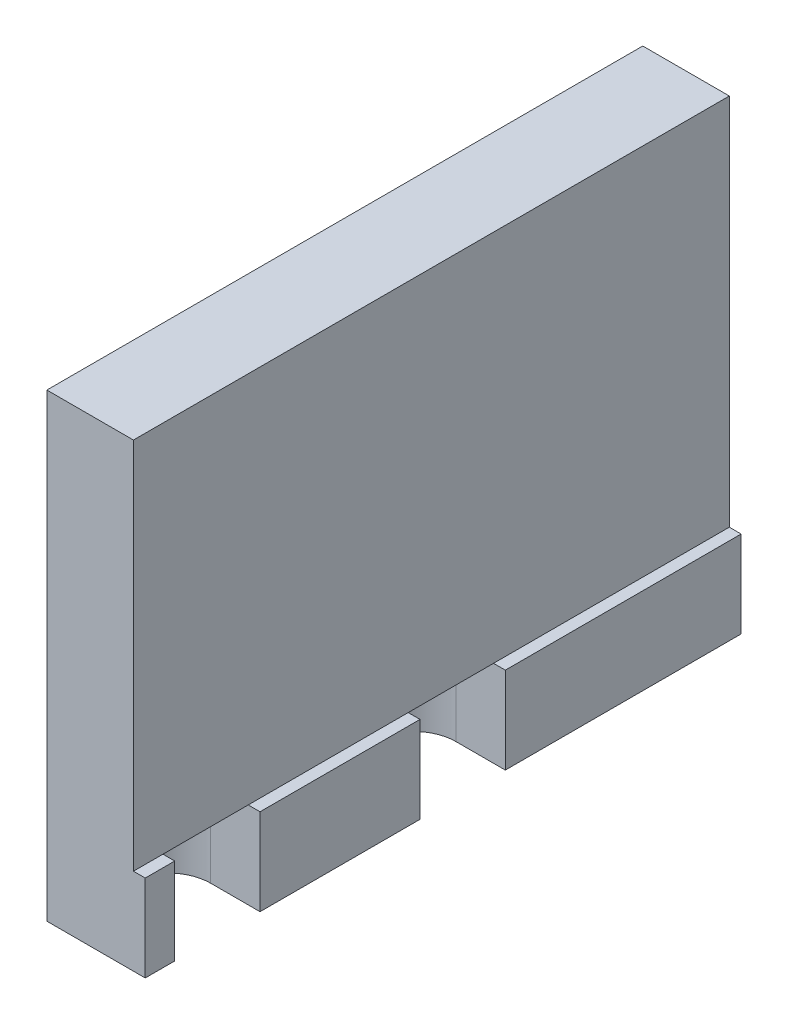
ISO-10303-21;
HEADER;
FILE_DESCRIPTION(('STEP AP214'),'2;1');
FILE_NAME('part.step','',(''),(''),'','','');
FILE_SCHEMA(('AUTOMOTIVE_DESIGN { 1 0 10303 214 1 1 1 1 }'));
ENDSEC;
DATA;
#1=APPLICATION_CONTEXT('core data for automotive mechanical design processes');
#2=APPLICATION_PROTOCOL_DEFINITION('international standard','automotive_design',2000,#1);
#3=PRODUCT_CONTEXT('',#1,'mechanical');
#4=PRODUCT('Part','Part','',(#3));
#5=PRODUCT_RELATED_PRODUCT_CATEGORY('part','',(#4));
#6=PRODUCT_DEFINITION_FORMATION('','',#4);
#7=PRODUCT_DEFINITION_CONTEXT('part definition',#1,'design');
#8=PRODUCT_DEFINITION('design','',#6,#7);
#9=PRODUCT_DEFINITION_SHAPE('','',#8);
#10=(LENGTH_UNIT() NAMED_UNIT(*) SI_UNIT(.MILLI.,.METRE.));
#11=(NAMED_UNIT(*) PLANE_ANGLE_UNIT() SI_UNIT($,.RADIAN.));
#12=(NAMED_UNIT(*) SI_UNIT($,.STERADIAN.) SOLID_ANGLE_UNIT());
#13=UNCERTAINTY_MEASURE_WITH_UNIT(LENGTH_MEASURE(1.E-05),#10,'distance_accuracy_value','');
#14=(GEOMETRIC_REPRESENTATION_CONTEXT(3) GLOBAL_UNCERTAINTY_ASSIGNED_CONTEXT((#13)) GLOBAL_UNIT_ASSIGNED_CONTEXT((#10,
#11,#12)) REPRESENTATION_CONTEXT('',''));
#15=CARTESIAN_POINT('',(0.,0.,0.));
#16=DIRECTION('',(0.,0.,1.));
#17=DIRECTION('',(1.,0.,0.));
#18=AXIS2_PLACEMENT_3D('',#15,#16,#17);
#19=CARTESIAN_POINT('',(-0.818281610185816,6.,27.));
#20=DIRECTION('',(0.,1.,0.));
#21=DIRECTION('',(0.,0.,1.));
#22=AXIS2_PLACEMENT_3D('',#19,#20,#21);
#23=PLANE('',#22);
#24=DIRECTION('',(1.,0.,0.));
#25=VECTOR('',#24,1.);
#26=CARTESIAN_POINT('',(-3.41828161018498,6.,7.95603271983645));
#27=LINE('',#26,#25);
#28=CARTESIAN_POINT('',(-0.818281610185816,6.,7.95603271983645));
#29=VERTEX_POINT('',#28);
#30=CARTESIAN_POINT('',(0.,6.,7.95603271983645));
#31=VERTEX_POINT('',#30);
#32=EDGE_CURVE('E239',#29,#31,#27,.T.);
#33=ORIENTED_EDGE('',*,*,#32,.F.);
#34=DIRECTION('',(0.,0.,-1.));
#35=VECTOR('',#34,1.);
#36=CARTESIAN_POINT('',(-0.818281610185816,6.,27.));
#37=LINE('',#36,#35);
#38=CARTESIAN_POINT('',(-0.818281610185812,6.,19.0439672801637));
#39=VERTEX_POINT('',#38);
#40=EDGE_CURVE('E204',#39,#29,#37,.T.);
#41=ORIENTED_EDGE('',*,*,#40,.F.);
#42=DIRECTION('',(-1.,0.,0.));
#43=VECTOR('',#42,1.);
#44=CARTESIAN_POINT('',(8.68171838981503,6.,19.0439672801637));
#45=LINE('',#44,#43);
#46=CARTESIAN_POINT('',(0.,6.,19.0439672801637));
#47=VERTEX_POINT('',#46);
#48=EDGE_CURVE('E242',#47,#39,#45,.T.);
#49=ORIENTED_EDGE('',*,*,#48,.F.);
#50=DIRECTION('',(0.,0.,-1.));
#51=VECTOR('',#50,1.);
#52=CARTESIAN_POINT('',(0.,6.,27.));
#53=LINE('',#52,#51);
#54=EDGE_CURVE('E216',#47,#31,#53,.T.);
#55=ORIENTED_EDGE('',*,*,#54,.T.);
#56=EDGE_LOOP('',(#33,#41,#49,#55));
#57=FACE_BOUND('',#56,.T.);
#58=ADVANCED_FACE('F37',(#57),#23,.T.);
#59=DIRECTION('',(1.,0.,0.));
#60=VECTOR('',#59,1.);
#61=CARTESIAN_POINT('',(-3.41828161018498,6.,24.9560327198365));
#62=LINE('',#61,#60);
#63=CARTESIAN_POINT('',(-0.818281610185816,6.,24.9560327198365));
#64=VERTEX_POINT('',#63);
#65=CARTESIAN_POINT('',(0.,6.,24.9560327198365));
#66=VERTEX_POINT('',#65);
#67=EDGE_CURVE('E276',#64,#66,#62,.T.);
#68=ORIENTED_EDGE('',*,*,#67,.F.);
#69=CARTESIAN_POINT('',(-0.818281610185816,6.,27.));
#70=VERTEX_POINT('',#69);
#71=EDGE_CURVE('E200',#70,#64,#37,.T.);
#72=ORIENTED_EDGE('',*,*,#71,.F.);
#73=DIRECTION('',(1.,0.,0.));
#74=VECTOR('',#73,1.);
#75=CARTESIAN_POINT('',(-0.818281610185816,6.,27.));
#76=LINE('',#75,#74);
#77=CARTESIAN_POINT('',(0.,6.,27.));
#78=VERTEX_POINT('',#77);
#79=EDGE_CURVE('E187',#70,#78,#76,.T.);
#80=ORIENTED_EDGE('',*,*,#79,.T.);
#81=EDGE_CURVE('E213',#78,#66,#53,.T.);
#82=ORIENTED_EDGE('',*,*,#81,.T.);
#83=EDGE_LOOP('',(#68,#72,#80,#82));
#84=FACE_BOUND('',#83,.T.);
#85=ADVANCED_FACE('F306',(#84),#23,.T.);
#86=CARTESIAN_POINT('',(0.,6.,27.));
#87=DIRECTION('',(1.,0.,0.));
#88=DIRECTION('',(0.,0.,-1.));
#89=AXIS2_PLACEMENT_3D('',#86,#87,#88);
#90=PLANE('',#89);
#91=DIRECTION('',(0.,-1.,0.));
#92=VECTOR('',#91,1.);
#93=CARTESIAN_POINT('',(0.,6.,7.95603271983646));
#94=LINE('',#93,#92);
#95=CARTESIAN_POINT('',(0.,0.,7.95603271983645));
#96=VERTEX_POINT('',#95);
#97=EDGE_CURVE('E11',#31,#96,#94,.T.);
#98=ORIENTED_EDGE('',*,*,#97,.F.);
#99=ORIENTED_EDGE('',*,*,#54,.F.);
#100=DIRECTION('',(0.,1.,0.));
#101=VECTOR('',#100,1.);
#102=CARTESIAN_POINT('',(0.,6.,19.0439672801637));
#103=LINE('',#102,#101);
#104=CARTESIAN_POINT('',(0.,0.,19.0439672801637));
#105=VERTEX_POINT('',#104);
#106=EDGE_CURVE('E203',#105,#47,#103,.T.);
#107=ORIENTED_EDGE('',*,*,#106,.F.);
#108=DIRECTION('',(0.,0.,-1.));
#109=VECTOR('',#108,1.);
#110=CARTESIAN_POINT('',(0.,0.,27.));
#111=LINE('',#110,#109);
#112=EDGE_CURVE('E211',#105,#96,#111,.T.);
#113=ORIENTED_EDGE('',*,*,#112,.T.);
#114=EDGE_LOOP('',(#98,#99,#107,#113));
#115=FACE_BOUND('',#114,.T.);
#116=ADVANCED_FACE('F246',(#115),#90,.T.);
#117=DIRECTION('',(0.,-1.,0.));
#118=VECTOR('',#117,1.);
#119=CARTESIAN_POINT('',(0.,6.,24.9560327198365));
#120=LINE('',#119,#118);
#121=CARTESIAN_POINT('',(0.,0.,24.9560327198365));
#122=VERTEX_POINT('',#121);
#123=EDGE_CURVE('E218',#66,#122,#120,.T.);
#124=ORIENTED_EDGE('',*,*,#123,.F.);
#125=ORIENTED_EDGE('',*,*,#81,.F.);
#126=DIRECTION('',(0.,-1.,0.));
#127=VECTOR('',#126,1.);
#128=CARTESIAN_POINT('',(0.,6.,27.));
#129=LINE('',#128,#127);
#130=CARTESIAN_POINT('',(0.,0.,27.));
#131=VERTEX_POINT('',#130);
#132=EDGE_CURVE('E190',#78,#131,#129,.T.);
#133=ORIENTED_EDGE('',*,*,#132,.T.);
#134=EDGE_CURVE('E208',#131,#122,#111,.T.);
#135=ORIENTED_EDGE('',*,*,#134,.T.);
#136=EDGE_LOOP('',(#124,#125,#133,#135));
#137=FACE_BOUND('',#136,.T.);
#138=ADVANCED_FACE('F310',(#137),#90,.T.);
#139=DIRECTION('',(-1.,0.,0.));
#140=VECTOR('',#139,1.);
#141=CARTESIAN_POINT('',(8.68171838981503,6.,2.04396728016366));
#142=LINE('',#141,#140);
#143=CARTESIAN_POINT('',(0.,6.,2.04396728016366));
#144=VERTEX_POINT('',#143);
#145=CARTESIAN_POINT('',(-0.818281610185816,6.,2.04396728016366));
#146=VERTEX_POINT('',#145);
#147=EDGE_CURVE('E222',#144,#146,#142,.T.);
#148=ORIENTED_EDGE('',*,*,#147,.F.);
#149=CARTESIAN_POINT('',(0.,6.,-14.2999999999999));
#150=VERTEX_POINT('',#149);
#151=EDGE_CURVE('E199',#144,#150,#53,.T.);
#152=ORIENTED_EDGE('',*,*,#151,.T.);
#153=DIRECTION('',(-1.,0.,0.));
#154=VECTOR('',#153,1.);
#155=CARTESIAN_POINT('',(-0.818281610185782,6.,-14.2999999999999));
#156=LINE('',#155,#154);
#157=CARTESIAN_POINT('',(-0.818281610185816,6.,-14.2999999999999));
#158=VERTEX_POINT('',#157);
#159=EDGE_CURVE('E182',#150,#158,#156,.T.);
#160=ORIENTED_EDGE('',*,*,#159,.T.);
#161=EDGE_CURVE('E205',#146,#158,#37,.T.);
#162=ORIENTED_EDGE('',*,*,#161,.F.);
#163=EDGE_LOOP('',(#148,#152,#160,#162));
#164=FACE_BOUND('',#163,.T.);
#165=ADVANCED_FACE('F39',(#164),#23,.T.);
#166=CARTESIAN_POINT('',(-0.818281610185823,76.4000000000001,27.));
#167=DIRECTION('',(1.,0.,0.));
#168=DIRECTION('',(0.,1.,0.));
#169=AXIS2_PLACEMENT_3D('',#166,#167,#168);
#170=PLANE('',#169);
#171=DIRECTION('',(0.,0.,-1.));
#172=VECTOR('',#171,1.);
#173=CARTESIAN_POINT('',(-0.8182816101858,31.8812314923491,51.7000000000001));
#174=LINE('',#173,#172);
#175=CARTESIAN_POINT('',(-0.818281610185811,31.8812314923491,27.));
#176=VERTEX_POINT('',#175);
#177=CARTESIAN_POINT('',(-0.818281610185818,31.8812314923491,-14.2999999999999));
#178=VERTEX_POINT('',#177);
#179=EDGE_CURVE('E52',#176,#178,#174,.T.);
#180=ORIENTED_EDGE('',*,*,#179,.F.);
#181=DIRECTION('',(0.,-1.,0.));
#182=VECTOR('',#181,1.);
#183=CARTESIAN_POINT('',(-0.818281610185823,76.4000000000001,27.));
#184=LINE('',#183,#182);
#185=EDGE_CURVE('E197',#176,#70,#184,.T.);
#186=ORIENTED_EDGE('',*,*,#185,.T.);
#187=ORIENTED_EDGE('',*,*,#71,.T.);
#188=DIRECTION('',(0.,0.,-1.));
#189=VECTOR('',#188,1.);
#190=CARTESIAN_POINT('',(-0.818281610185816,6.00000000000001,27.));
#191=LINE('',#190,#189);
#192=EDGE_CURVE('E176',#64,#39,#191,.T.);
#193=ORIENTED_EDGE('',*,*,#192,.T.);
#194=ORIENTED_EDGE('',*,*,#40,.T.);
#195=DIRECTION('',(0.,0.,-1.));
#196=VECTOR('',#195,1.);
#197=CARTESIAN_POINT('',(-0.818281610185816,6.00000000000001,27.));
#198=LINE('',#197,#196);
#199=EDGE_CURVE('E171',#29,#146,#198,.T.);
#200=ORIENTED_EDGE('',*,*,#199,.T.);
#201=ORIENTED_EDGE('',*,*,#161,.T.);
#202=DIRECTION('',(0.,1.,0.));
#203=VECTOR('',#202,1.);
#204=CARTESIAN_POINT('',(-0.818281610185823,76.4000000000001,-14.2999999999999));
#205=LINE('',#204,#203);
#206=EDGE_CURVE('E185',#158,#178,#205,.T.);
#207=ORIENTED_EDGE('',*,*,#206,.T.);
#208=EDGE_LOOP('',(#180,#186,#187,#193,#194,#200,#201,#207));
#209=FACE_BOUND('',#208,.T.);
#210=ADVANCED_FACE('F294',(#209),#170,.T.);
#211=CARTESIAN_POINT('',(-6.81828161018582,0.,27.));
#212=DIRECTION('',(-1.,0.,0.));
#213=DIRECTION('',(0.,0.,1.));
#214=AXIS2_PLACEMENT_3D('',#211,#212,#213);
#215=PLANE('',#214);
#216=DIRECTION('',(0.,0.,-1.));
#217=VECTOR('',#216,1.);
#218=CARTESIAN_POINT('',(-6.81828161018579,31.8812314923491,51.7000000000001));
#219=LINE('',#218,#217);
#220=CARTESIAN_POINT('',(-6.8182816101858,31.8812314923491,27.));
#221=VERTEX_POINT('',#220);
#222=CARTESIAN_POINT('',(-6.81828161018582,31.8812314923491,-14.2999999999999));
#223=VERTEX_POINT('',#222);
#224=EDGE_CURVE('E150',#221,#223,#219,.T.);
#225=ORIENTED_EDGE('',*,*,#224,.T.);
#226=DIRECTION('',(0.,-1.,0.));
#227=VECTOR('',#226,1.);
#228=CARTESIAN_POINT('',(-6.81828161018582,0.,-14.2999999999999));
#229=LINE('',#228,#227);
#230=CARTESIAN_POINT('',(-6.81828161018582,0.,-14.2999999999999));
#231=VERTEX_POINT('',#230);
#232=EDGE_CURVE('E160',#223,#231,#229,.T.);
#233=ORIENTED_EDGE('',*,*,#232,.T.);
#234=DIRECTION('',(0.,0.,-1.));
#235=VECTOR('',#234,1.);
#236=CARTESIAN_POINT('',(-6.81828161018582,0.,27.));
#237=LINE('',#236,#235);
#238=CARTESIAN_POINT('',(-6.81828161018582,0.,27.));
#239=VERTEX_POINT('',#238);
#240=EDGE_CURVE('E206',#239,#231,#237,.T.);
#241=ORIENTED_EDGE('',*,*,#240,.F.);
#242=DIRECTION('',(0.,1.,0.));
#243=VECTOR('',#242,1.);
#244=CARTESIAN_POINT('',(-6.81828161018582,0.,27.));
#245=LINE('',#244,#243);
#246=EDGE_CURVE('E163',#239,#221,#245,.T.);
#247=ORIENTED_EDGE('',*,*,#246,.T.);
#248=EDGE_LOOP('',(#225,#233,#241,#247));
#249=FACE_BOUND('',#248,.T.);
#250=ADVANCED_FACE('F159',(#249),#215,.T.);
#251=CARTESIAN_POINT('',(0.,0.,27.));
#252=DIRECTION('',(0.,-1.,0.));
#253=DIRECTION('',(1.,0.,0.));
#254=AXIS2_PLACEMENT_3D('',#251,#252,#253);
#255=PLANE('',#254);
#256=DIRECTION('',(1.,0.,0.));
#257=VECTOR('',#256,1.);
#258=CARTESIAN_POINT('',(-3.41828161018498,0.,7.95603271983645));
#259=LINE('',#258,#257);
#260=CARTESIAN_POINT('',(-3.41828161018498,0.,7.95603271983645));
#261=VERTEX_POINT('',#260);
#262=EDGE_CURVE('E229',#261,#96,#259,.T.);
#263=ORIENTED_EDGE('',*,*,#262,.T.);
#264=ORIENTED_EDGE('',*,*,#112,.F.);
#265=DIRECTION('',(-1.,0.,0.));
#266=VECTOR('',#265,1.);
#267=CARTESIAN_POINT('',(8.68171838981503,0.,19.0439672801637));
#268=LINE('',#267,#266);
#269=CARTESIAN_POINT('',(-3.41828161018498,0.,19.0439672801637));
#270=VERTEX_POINT('',#269);
#271=EDGE_CURVE('E283',#105,#270,#268,.T.);
#272=ORIENTED_EDGE('',*,*,#271,.T.);
#273=CARTESIAN_POINT('',(-3.41828161018498,0.,22.0000000000001));
#274=DIRECTION('',(0.,-1.,0.));
#275=DIRECTION('',(1.,0.,0.));
#276=AXIS2_PLACEMENT_3D('',#273,#274,#275);
#277=CIRCLE('',#276,2.95603271983639);
#278=CARTESIAN_POINT('',(-3.41828161018498,0.,24.9560327198365));
#279=VERTEX_POINT('',#278);
#280=EDGE_CURVE('E284',#270,#279,#277,.F.);
#281=ORIENTED_EDGE('',*,*,#280,.T.);
#282=DIRECTION('',(1.,0.,0.));
#283=VECTOR('',#282,1.);
#284=CARTESIAN_POINT('',(-3.41828161018498,0.,24.9560327198365));
#285=LINE('',#284,#283);
#286=EDGE_CURVE('E280',#279,#122,#285,.T.);
#287=ORIENTED_EDGE('',*,*,#286,.T.);
#288=ORIENTED_EDGE('',*,*,#134,.F.);
#289=DIRECTION('',(-1.,0.,0.));
#290=VECTOR('',#289,1.);
#291=CARTESIAN_POINT('',(0.,0.,27.));
#292=LINE('',#291,#290);
#293=EDGE_CURVE('E193',#131,#239,#292,.T.);
#294=ORIENTED_EDGE('',*,*,#293,.T.);
#295=ORIENTED_EDGE('',*,*,#240,.T.);
#296=DIRECTION('',(1.,0.,0.));
#297=VECTOR('',#296,1.);
#298=CARTESIAN_POINT('',(0.,0.,-14.2999999999999));
#299=LINE('',#298,#297);
#300=CARTESIAN_POINT('',(0.,0.,-14.2999999999999));
#301=VERTEX_POINT('',#300);
#302=EDGE_CURVE('E170',#231,#301,#299,.T.);
#303=ORIENTED_EDGE('',*,*,#302,.T.);
#304=CARTESIAN_POINT('',(0.,0.,2.04396728016366));
#305=VERTEX_POINT('',#304);
#306=EDGE_CURVE('E212',#305,#301,#111,.T.);
#307=ORIENTED_EDGE('',*,*,#306,.F.);
#308=DIRECTION('',(-1.,0.,0.));
#309=VECTOR('',#308,1.);
#310=CARTESIAN_POINT('',(8.68171838981503,0.,2.04396728016366));
#311=LINE('',#310,#309);
#312=CARTESIAN_POINT('',(-3.41828161018497,0.,2.04396728016366));
#313=VERTEX_POINT('',#312);
#314=EDGE_CURVE('E60',#305,#313,#311,.T.);
#315=ORIENTED_EDGE('',*,*,#314,.T.);
#316=CARTESIAN_POINT('',(-3.41828161018497,0.,5.00000000000006));
#317=DIRECTION('',(0.,-1.,0.));
#318=DIRECTION('',(1.,0.,0.));
#319=AXIS2_PLACEMENT_3D('',#316,#317,#318);
#320=CIRCLE('',#319,2.9560327198364);
#321=EDGE_CURVE('E258',#313,#261,#320,.F.);
#322=ORIENTED_EDGE('',*,*,#321,.T.);
#323=EDGE_LOOP('',(#263,#264,#272,#281,#287,#288,#294,#295,#303,#307,#315,#322));
#324=FACE_BOUND('',#323,.T.);
#325=ADVANCED_FACE('F256',(#324),#255,.T.);
#326=DIRECTION('',(0.,1.,0.));
#327=VECTOR('',#326,1.);
#328=CARTESIAN_POINT('',(0.,6.,2.04396728016366));
#329=LINE('',#328,#327);
#330=EDGE_CURVE('E45',#305,#144,#329,.T.);
#331=ORIENTED_EDGE('',*,*,#330,.F.);
#332=ORIENTED_EDGE('',*,*,#306,.T.);
#333=DIRECTION('',(0.,1.,0.));
#334=VECTOR('',#333,1.);
#335=CARTESIAN_POINT('',(0.,6.,-14.2999999999999));
#336=LINE('',#335,#334);
#337=EDGE_CURVE('E173',#301,#150,#336,.T.);
#338=ORIENTED_EDGE('',*,*,#337,.T.);
#339=ORIENTED_EDGE('',*,*,#151,.F.);
#340=EDGE_LOOP('',(#331,#332,#338,#339));
#341=FACE_BOUND('',#340,.T.);
#342=ADVANCED_FACE('F232',(#341),#90,.T.);
#343=CARTESIAN_POINT('',(0.,0.,27.));
#344=DIRECTION('',(0.,0.,-1.));
#345=DIRECTION('',(-1.,0.,0.));
#346=AXIS2_PLACEMENT_3D('',#343,#344,#345);
#347=PLANE('',#346);
#348=ORIENTED_EDGE('',*,*,#185,.F.);
#349=DIRECTION('',(-1.,0.,0.));
#350=VECTOR('',#349,1.);
#351=CARTESIAN_POINT('',(0.,31.8812314923491,27.));
#352=LINE('',#351,#350);
#353=EDGE_CURVE('E164',#176,#221,#352,.T.);
#354=ORIENTED_EDGE('',*,*,#353,.T.);
#355=ORIENTED_EDGE('',*,*,#246,.F.);
#356=ORIENTED_EDGE('',*,*,#293,.F.);
#357=ORIENTED_EDGE('',*,*,#132,.F.);
#358=ORIENTED_EDGE('',*,*,#79,.F.);
#359=EDGE_LOOP('',(#348,#354,#355,#356,#357,#358));
#360=FACE_BOUND('',#359,.T.);
#361=ADVANCED_FACE('F314',(#360),#347,.F.);
#362=CARTESIAN_POINT('',(15.631718389815,-11.4000000000002,-14.2999999999999));
#363=DIRECTION('',(0.,0.,1.));
#364=DIRECTION('',(-1.,0.,0.));
#365=AXIS2_PLACEMENT_3D('',#362,#363,#364);
#366=PLANE('',#365);
#367=ORIENTED_EDGE('',*,*,#232,.F.);
#368=DIRECTION('',(-1.,0.,0.));
#369=VECTOR('',#368,1.);
#370=CARTESIAN_POINT('',(-0.818281610185829,31.8812314923491,-14.2999999999999));
#371=LINE('',#370,#369);
#372=EDGE_CURVE('E147',#178,#223,#371,.T.);
#373=ORIENTED_EDGE('',*,*,#372,.F.);
#374=ORIENTED_EDGE('',*,*,#206,.F.);
#375=ORIENTED_EDGE('',*,*,#159,.F.);
#376=ORIENTED_EDGE('',*,*,#337,.F.);
#377=ORIENTED_EDGE('',*,*,#302,.F.);
#378=EDGE_LOOP('',(#367,#373,#374,#375,#376,#377));
#379=FACE_BOUND('',#378,.T.);
#380=ADVANCED_FACE('F167',(#379),#366,.F.);
#381=CARTESIAN_POINT('',(-3.41828161018498,6.,22.0000000000001));
#382=DIRECTION('',(0.,-1.,0.));
#383=DIRECTION('',(0.,0.,-1.));
#384=AXIS2_PLACEMENT_3D('',#381,#382,#383);
#385=PLANE('',#384);
#386=CARTESIAN_POINT('',(-3.41828161018498,6.,24.9560327198365));
#387=VERTEX_POINT('',#386);
#388=EDGE_CURVE('E273',#387,#64,#62,.T.);
#389=ORIENTED_EDGE('',*,*,#388,.F.);
#390=CARTESIAN_POINT('',(-3.41828161018498,6.,22.0000000000001));
#391=DIRECTION('',(0.,1.,0.));
#392=DIRECTION('',(0.,0.,-1.));
#393=AXIS2_PLACEMENT_3D('',#390,#391,#392);
#394=CIRCLE('',#393,2.95603271983639);
#395=CARTESIAN_POINT('',(-3.41828161018498,6.,19.0439672801637));
#396=VERTEX_POINT('',#395);
#397=EDGE_CURVE('E277',#396,#387,#394,.T.);
#398=ORIENTED_EDGE('',*,*,#397,.F.);
#399=EDGE_CURVE('E271',#39,#396,#45,.T.);
#400=ORIENTED_EDGE('',*,*,#399,.F.);
#401=ORIENTED_EDGE('',*,*,#192,.F.);
#402=EDGE_LOOP('',(#389,#398,#400,#401));
#403=FACE_BOUND('',#402,.T.);
#404=ADVANCED_FACE('F298',(#403),#385,.T.);
#405=CARTESIAN_POINT('',(-3.41828161018498,-18.9575056156138,24.9560327198365));
#406=DIRECTION('',(0.,0.,1.));
#407=DIRECTION('',(1.,0.,0.));
#408=AXIS2_PLACEMENT_3D('',#405,#406,#407);
#409=PLANE('',#408);
#410=ORIENTED_EDGE('',*,*,#123,.T.);
#411=ORIENTED_EDGE('',*,*,#286,.F.);
#412=DIRECTION('',(0.,1.,0.));
#413=VECTOR('',#412,1.);
#414=CARTESIAN_POINT('',(-3.41828161018498,-18.9575056156138,24.9560327198365));
#415=LINE('',#414,#413);
#416=EDGE_CURVE('E287',#279,#387,#415,.T.);
#417=ORIENTED_EDGE('',*,*,#416,.T.);
#418=ORIENTED_EDGE('',*,*,#388,.T.);
#419=ORIENTED_EDGE('',*,*,#67,.T.);
#420=EDGE_LOOP('',(#410,#411,#417,#418,#419));
#421=FACE_BOUND('',#420,.T.);
#422=ADVANCED_FACE('F302',(#421),#409,.F.);
#423=CARTESIAN_POINT('',(8.68171838981503,-18.9575056156138,19.0439672801637));
#424=DIRECTION('',(0.,0.,-1.));
#425=DIRECTION('',(-1.,0.,0.));
#426=AXIS2_PLACEMENT_3D('',#423,#424,#425);
#427=PLANE('',#426);
#428=ORIENTED_EDGE('',*,*,#106,.T.);
#429=ORIENTED_EDGE('',*,*,#48,.T.);
#430=ORIENTED_EDGE('',*,*,#399,.T.);
#431=DIRECTION('',(0.,1.,0.));
#432=VECTOR('',#431,1.);
#433=CARTESIAN_POINT('',(-3.41828161018498,-18.9575056156138,19.0439672801637));
#434=LINE('',#433,#432);
#435=EDGE_CURVE('E288',#270,#396,#434,.T.);
#436=ORIENTED_EDGE('',*,*,#435,.F.);
#437=ORIENTED_EDGE('',*,*,#271,.F.);
#438=EDGE_LOOP('',(#428,#429,#430,#436,#437));
#439=FACE_BOUND('',#438,.T.);
#440=ADVANCED_FACE('F319',(#439),#427,.F.);
#441=CARTESIAN_POINT('',(-3.41828161018498,-18.9575056156138,22.0000000000001));
#442=DIRECTION('',(0.,1.,0.));
#443=DIRECTION('',(0.,0.,1.));
#444=AXIS2_PLACEMENT_3D('',#441,#442,#443);
#445=CYLINDRICAL_SURFACE('',#444,2.95603271983639);
#446=ORIENTED_EDGE('',*,*,#435,.T.);
#447=ORIENTED_EDGE('',*,*,#397,.T.);
#448=ORIENTED_EDGE('',*,*,#416,.F.);
#449=ORIENTED_EDGE('',*,*,#280,.F.);
#450=EDGE_LOOP('',(#446,#447,#448,#449));
#451=FACE_BOUND('',#450,.T.);
#452=ADVANCED_FACE('F316',(#451),#445,.F.);
#453=CARTESIAN_POINT('',(-3.41828161018497,6.,5.00000000000006));
#454=DIRECTION('',(0.,-1.,0.));
#455=DIRECTION('',(0.,0.,-1.));
#456=AXIS2_PLACEMENT_3D('',#453,#454,#455);
#457=PLANE('',#456);
#458=CARTESIAN_POINT('',(-3.41828161018498,6.,7.95603271983645));
#459=VERTEX_POINT('',#458);
#460=EDGE_CURVE('E324',#459,#29,#27,.T.);
#461=ORIENTED_EDGE('',*,*,#460,.F.);
#462=CARTESIAN_POINT('',(-3.41828161018497,6.,5.00000000000006));
#463=DIRECTION('',(0.,1.,0.));
#464=DIRECTION('',(0.,0.,-1.));
#465=AXIS2_PLACEMENT_3D('',#462,#463,#464);
#466=CIRCLE('',#465,2.9560327198364);
#467=CARTESIAN_POINT('',(-3.41828161018497,6.,2.04396728016366));
#468=VERTEX_POINT('',#467);
#469=EDGE_CURVE('E264',#468,#459,#466,.T.);
#470=ORIENTED_EDGE('',*,*,#469,.F.);
#471=EDGE_CURVE('E230',#146,#468,#142,.T.);
#472=ORIENTED_EDGE('',*,*,#471,.F.);
#473=ORIENTED_EDGE('',*,*,#199,.F.);
#474=EDGE_LOOP('',(#461,#470,#472,#473));
#475=FACE_BOUND('',#474,.T.);
#476=ADVANCED_FACE('F322',(#475),#457,.T.);
#477=CARTESIAN_POINT('',(-3.41828161018498,-18.9575056156138,7.95603271983645));
#478=DIRECTION('',(0.,0.,1.));
#479=DIRECTION('',(1.,0.,0.));
#480=AXIS2_PLACEMENT_3D('',#477,#478,#479);
#481=PLANE('',#480);
#482=ORIENTED_EDGE('',*,*,#97,.T.);
#483=ORIENTED_EDGE('',*,*,#262,.F.);
#484=DIRECTION('',(0.,1.,0.));
#485=VECTOR('',#484,1.);
#486=CARTESIAN_POINT('',(-3.41828161018498,-18.9575056156138,7.95603271983645));
#487=LINE('',#486,#485);
#488=EDGE_CURVE('E266',#261,#459,#487,.T.);
#489=ORIENTED_EDGE('',*,*,#488,.T.);
#490=ORIENTED_EDGE('',*,*,#460,.T.);
#491=ORIENTED_EDGE('',*,*,#32,.T.);
#492=EDGE_LOOP('',(#482,#483,#489,#490,#491));
#493=FACE_BOUND('',#492,.T.);
#494=ADVANCED_FACE('F251',(#493),#481,.F.);
#495=CARTESIAN_POINT('',(8.68171838981503,-18.9575056156138,2.04396728016366));
#496=DIRECTION('',(0.,0.,-1.));
#497=DIRECTION('',(-1.,0.,0.));
#498=AXIS2_PLACEMENT_3D('',#495,#496,#497);
#499=PLANE('',#498);
#500=ORIENTED_EDGE('',*,*,#330,.T.);
#501=ORIENTED_EDGE('',*,*,#147,.T.);
#502=ORIENTED_EDGE('',*,*,#471,.T.);
#503=DIRECTION('',(0.,1.,0.));
#504=VECTOR('',#503,1.);
#505=CARTESIAN_POINT('',(-3.41828161018497,-18.9575056156138,2.04396728016366));
#506=LINE('',#505,#504);
#507=EDGE_CURVE('E260',#313,#468,#506,.T.);
#508=ORIENTED_EDGE('',*,*,#507,.F.);
#509=ORIENTED_EDGE('',*,*,#314,.F.);
#510=EDGE_LOOP('',(#500,#501,#502,#508,#509));
#511=FACE_BOUND('',#510,.T.);
#512=ADVANCED_FACE('F221',(#511),#499,.F.);
#513=CARTESIAN_POINT('',(-3.41828161018497,-18.9575056156138,5.00000000000006));
#514=DIRECTION('',(0.,1.,0.));
#515=DIRECTION('',(0.,0.,1.));
#516=AXIS2_PLACEMENT_3D('',#513,#514,#515);
#517=CYLINDRICAL_SURFACE('',#516,2.9560327198364);
#518=ORIENTED_EDGE('',*,*,#507,.T.);
#519=ORIENTED_EDGE('',*,*,#469,.T.);
#520=ORIENTED_EDGE('',*,*,#488,.F.);
#521=ORIENTED_EDGE('',*,*,#321,.F.);
#522=EDGE_LOOP('',(#518,#519,#520,#521));
#523=FACE_BOUND('',#522,.T.);
#524=ADVANCED_FACE('F329',(#523),#517,.F.);
#525=CARTESIAN_POINT('',(-0.8182816101858,31.8812314923491,51.7000000000001));
#526=DIRECTION('',(0.,-1.,0.));
#527=DIRECTION('',(0.,0.,-1.));
#528=AXIS2_PLACEMENT_3D('',#525,#526,#527);
#529=PLANE('',#528);
#530=ORIENTED_EDGE('',*,*,#179,.T.);
#531=ORIENTED_EDGE('',*,*,#372,.T.);
#532=ORIENTED_EDGE('',*,*,#224,.F.);
#533=ORIENTED_EDGE('',*,*,#353,.F.);
#534=EDGE_LOOP('',(#530,#531,#532,#533));
#535=FACE_BOUND('',#534,.T.);
#536=ADVANCED_FACE('F149',(#535),#529,.F.);
#537=CLOSED_SHELL('',(#58,#85,#116,#138,#165,#210,#250,#325,#342,#361,#380,#404,#422,#440,#452,
#476,#494,#512,#524,#536));
#538=MANIFOLD_SOLID_BREP('B2',#537);
#539=ADVANCED_BREP_SHAPE_REPRESENTATION('',(#18,#538),#14);
#540=SHAPE_DEFINITION_REPRESENTATION(#9,#539);
ENDSEC;
END-ISO-10303-21;
